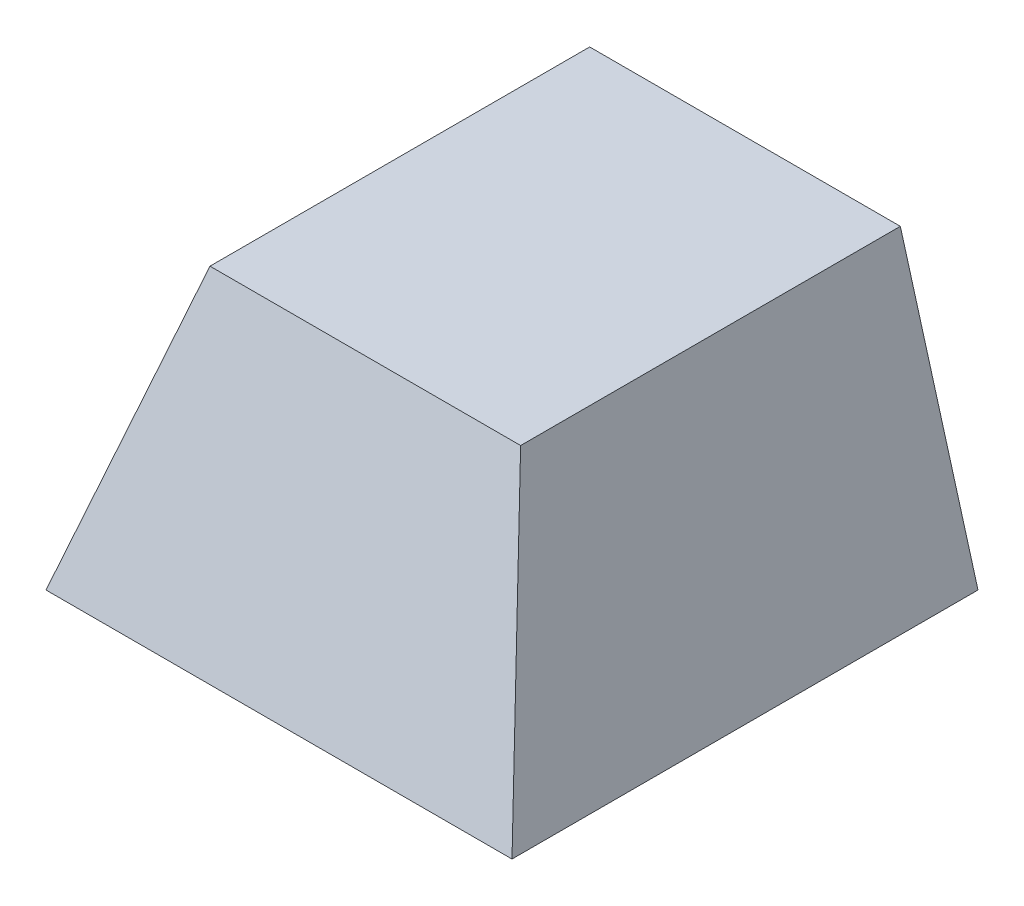
ISO-10303-21;
HEADER;
FILE_DESCRIPTION(('STEP AP214'),'2;1');
FILE_NAME('part.step','',(''),(''),'','','');
FILE_SCHEMA(('AUTOMOTIVE_DESIGN { 1 0 10303 214 1 1 1 1 }'));
ENDSEC;
DATA;
#1=APPLICATION_CONTEXT('core data for automotive mechanical design processes');
#2=APPLICATION_PROTOCOL_DEFINITION('international standard','automotive_design',2000,#1);
#3=PRODUCT_CONTEXT('',#1,'mechanical');
#4=PRODUCT('Part','Part','',(#3));
#5=PRODUCT_RELATED_PRODUCT_CATEGORY('part','',(#4));
#6=PRODUCT_DEFINITION_FORMATION('','',#4);
#7=PRODUCT_DEFINITION_CONTEXT('part definition',#1,'design');
#8=PRODUCT_DEFINITION('design','',#6,#7);
#9=PRODUCT_DEFINITION_SHAPE('','',#8);
#10=(LENGTH_UNIT() NAMED_UNIT(*) SI_UNIT(.MILLI.,.METRE.));
#11=(NAMED_UNIT(*) PLANE_ANGLE_UNIT() SI_UNIT($,.RADIAN.));
#12=(NAMED_UNIT(*) SI_UNIT($,.STERADIAN.) SOLID_ANGLE_UNIT());
#13=UNCERTAINTY_MEASURE_WITH_UNIT(LENGTH_MEASURE(1.E-05),#10,'distance_accuracy_value','');
#14=(GEOMETRIC_REPRESENTATION_CONTEXT(3) GLOBAL_UNCERTAINTY_ASSIGNED_CONTEXT((#13)) GLOBAL_UNIT_ASSIGNED_CONTEXT((#10,
#11,#12)) REPRESENTATION_CONTEXT('',''));
#15=CARTESIAN_POINT('',(0.,0.,0.));
#16=DIRECTION('',(0.,0.,1.));
#17=DIRECTION('',(1.,0.,0.));
#18=AXIS2_PLACEMENT_3D('',#15,#16,#17);
#19=CARTESIAN_POINT('',(-124.492349516088,-61.6423190247624,270.));
#20=DIRECTION('',(0.,1.,0.));
#21=DIRECTION('',(-1.,0.,0.));
#22=AXIS2_PLACEMENT_3D('',#19,#20,#21);
#23=PLANE('',#22);
#24=DIRECTION('',(1.,0.,0.));
#25=VECTOR('',#24,1.);
#26=CARTESIAN_POINT('',(-124.492349516088,-61.6423190247624,0.));
#27=LINE('',#26,#25);
#28=CARTESIAN_POINT('',(-124.492349516088,-61.6423190247624,0.));
#29=VERTEX_POINT('',#28);
#30=CARTESIAN_POINT('',(145.507650483912,-61.6423190247624,0.));
#31=VERTEX_POINT('',#30);
#32=EDGE_CURVE('E85',#29,#31,#27,.T.);
#33=ORIENTED_EDGE('',*,*,#32,.T.);
#34=DIRECTION('',(0.,0.,-1.));
#35=VECTOR('',#34,1.);
#36=CARTESIAN_POINT('',(145.507650483912,-61.6423190247624,270.));
#37=LINE('',#36,#35);
#38=CARTESIAN_POINT('',(145.507650483912,-61.6423190247624,270.));
#39=VERTEX_POINT('',#38);
#40=EDGE_CURVE('E11',#39,#31,#37,.T.);
#41=ORIENTED_EDGE('',*,*,#40,.F.);
#42=DIRECTION('',(1.,0.,0.));
#43=VECTOR('',#42,1.);
#44=CARTESIAN_POINT('',(-124.492349516088,-61.6423190247624,270.));
#45=LINE('',#44,#43);
#46=CARTESIAN_POINT('',(-124.492349516088,-61.6423190247624,270.));
#47=VERTEX_POINT('',#46);
#48=EDGE_CURVE('E86',#47,#39,#45,.T.);
#49=ORIENTED_EDGE('',*,*,#48,.F.);
#50=DIRECTION('',(0.,0.,-1.));
#51=VECTOR('',#50,1.);
#52=CARTESIAN_POINT('',(-124.492349516088,-61.6423190247624,270.));
#53=LINE('',#52,#51);
#54=EDGE_CURVE('E72',#47,#29,#53,.T.);
#55=ORIENTED_EDGE('',*,*,#54,.T.);
#56=EDGE_LOOP('',(#33,#41,#49,#55));
#57=FACE_BOUND('',#56,.T.);
#58=ADVANCED_FACE('F32',(#57),#23,.F.);
#59=CARTESIAN_POINT('',(145.507650483912,-61.6423190247624,270.));
#60=DIRECTION('',(-0.962650940153899,-0.270745576918285,0.));
#61=DIRECTION('',(0.270745576918285,-0.962650940153899,0.));
#62=AXIS2_PLACEMENT_3D('',#59,#60,#61);
#63=PLANE('',#62);
#64=DIRECTION('',(0.,0.,-1.));
#65=VECTOR('',#64,1.);
#66=CARTESIAN_POINT('',(100.507650483912,98.3576809752376,270.));
#67=LINE('',#66,#65);
#68=CARTESIAN_POINT('',(100.507650483912,98.3576809752376,220.));
#69=VERTEX_POINT('',#68);
#70=CARTESIAN_POINT('',(100.507650483912,98.3576809752376,0.));
#71=VERTEX_POINT('',#70);
#72=EDGE_CURVE('E40',#69,#71,#67,.T.);
#73=ORIENTED_EDGE('',*,*,#72,.F.);
#74=DIRECTION('',(0.259268040862055,-0.921841923065084,0.288075600957839));
#75=VECTOR('',#74,1.);
#76=CARTESIAN_POINT('',(145.507650483912,-61.6423190247624,270.));
#77=LINE('',#76,#75);
#78=EDGE_CURVE('E98',#69,#39,#77,.T.);
#79=ORIENTED_EDGE('',*,*,#78,.T.);
#80=ORIENTED_EDGE('',*,*,#40,.T.);
#81=DIRECTION('',(-0.270745576918285,0.962650940153899,0.));
#82=VECTOR('',#81,1.);
#83=CARTESIAN_POINT('',(145.507650483912,-61.6423190247624,0.));
#84=LINE('',#83,#82);
#85=EDGE_CURVE('E80',#31,#71,#84,.T.);
#86=ORIENTED_EDGE('',*,*,#85,.T.);
#87=EDGE_LOOP('',(#73,#79,#80,#86));
#88=FACE_BOUND('',#87,.T.);
#89=ADVANCED_FACE('F100',(#88),#63,.F.);
#90=CARTESIAN_POINT('',(-79.492349516088,98.3576809752376,270.));
#91=DIRECTION('',(0.,-1.,0.));
#92=DIRECTION('',(1.,0.,0.));
#93=AXIS2_PLACEMENT_3D('',#90,#91,#92);
#94=PLANE('',#93);
#95=DIRECTION('',(0.,0.,-1.));
#96=VECTOR('',#95,1.);
#97=CARTESIAN_POINT('',(-79.492349516088,98.3576809752376,270.));
#98=LINE('',#97,#96);
#99=CARTESIAN_POINT('',(-79.492349516088,98.3576809752376,220.));
#100=VERTEX_POINT('',#99);
#101=CARTESIAN_POINT('',(-79.492349516088,98.3576809752376,0.));
#102=VERTEX_POINT('',#101);
#103=EDGE_CURVE('E63',#100,#102,#98,.T.);
#104=ORIENTED_EDGE('',*,*,#103,.F.);
#105=DIRECTION('',(-1.,0.,0.));
#106=VECTOR('',#105,1.);
#107=CARTESIAN_POINT('',(200.507650483912,98.3576809752376,220.));
#108=LINE('',#107,#106);
#109=EDGE_CURVE('E101',#69,#100,#108,.T.);
#110=ORIENTED_EDGE('',*,*,#109,.F.);
#111=ORIENTED_EDGE('',*,*,#72,.T.);
#112=DIRECTION('',(-1.,0.,0.));
#113=VECTOR('',#112,1.);
#114=CARTESIAN_POINT('',(-79.492349516088,98.3576809752376,0.));
#115=LINE('',#114,#113);
#116=EDGE_CURVE('E75',#71,#102,#115,.T.);
#117=ORIENTED_EDGE('',*,*,#116,.T.);
#118=EDGE_LOOP('',(#104,#110,#111,#117));
#119=FACE_BOUND('',#118,.T.);
#120=ADVANCED_FACE('F76',(#119),#94,.F.);
#121=CARTESIAN_POINT('',(-124.492349516088,-61.6423190247624,270.));
#122=DIRECTION('',(0.962650940153899,-0.270745576918284,0.));
#123=DIRECTION('',(0.270745576918284,0.962650940153899,0.));
#124=AXIS2_PLACEMENT_3D('',#121,#122,#123);
#125=PLANE('',#124);
#126=ORIENTED_EDGE('',*,*,#54,.F.);
#127=DIRECTION('',(-0.259268040862055,-0.921841923065084,0.288075600957839));
#128=VECTOR('',#127,1.);
#129=CARTESIAN_POINT('',(-81.2252389850218,92.1962961968061,221.92543274326));
#130=LINE('',#129,#128);
#131=EDGE_CURVE('E47',#100,#47,#130,.T.);
#132=ORIENTED_EDGE('',*,*,#131,.F.);
#133=ORIENTED_EDGE('',*,*,#103,.T.);
#134=DIRECTION('',(-0.270745576918284,-0.962650940153899,0.));
#135=VECTOR('',#134,1.);
#136=CARTESIAN_POINT('',(-124.492349516088,-61.6423190247624,0.));
#137=LINE('',#136,#135);
#138=EDGE_CURVE('E67',#102,#29,#137,.T.);
#139=ORIENTED_EDGE('',*,*,#138,.T.);
#140=EDGE_LOOP('',(#126,#132,#133,#139));
#141=FACE_BOUND('',#140,.T.);
#142=ADVANCED_FACE('F65',(#141),#125,.F.);
#143=CARTESIAN_POINT('',(0.,0.,0.));
#144=DIRECTION('',(0.,0.,1.));
#145=DIRECTION('',(1.,0.,0.));
#146=AXIS2_PLACEMENT_3D('',#143,#144,#145);
#147=PLANE('',#146);
#148=ORIENTED_EDGE('',*,*,#32,.F.);
#149=ORIENTED_EDGE('',*,*,#138,.F.);
#150=ORIENTED_EDGE('',*,*,#116,.F.);
#151=ORIENTED_EDGE('',*,*,#85,.F.);
#152=EDGE_LOOP('',(#148,#149,#150,#151));
#153=FACE_BOUND('',#152,.T.);
#154=ADVANCED_FACE('F83',(#153),#147,.F.);
#155=CARTESIAN_POINT('',(198.774761014978,92.1962961968061,221.92543274326));
#156=DIRECTION('',(0.,-0.298274993135947,-0.95447997803503));
#157=DIRECTION('',(0.,0.95447997803503,-0.298274993135947));
#158=AXIS2_PLACEMENT_3D('',#155,#156,#157);
#159=PLANE('',#158);
#160=ORIENTED_EDGE('',*,*,#109,.T.);
#161=ORIENTED_EDGE('',*,*,#131,.T.);
#162=ORIENTED_EDGE('',*,*,#48,.T.);
#163=ORIENTED_EDGE('',*,*,#78,.F.);
#164=EDGE_LOOP('',(#160,#161,#162,#163));
#165=FACE_BOUND('',#164,.T.);
#166=ADVANCED_FACE('F96',(#165),#159,.F.);
#167=CLOSED_SHELL('',(#58,#89,#120,#142,#154,#166));
#168=MANIFOLD_SOLID_BREP('B2',#167);
#169=ADVANCED_BREP_SHAPE_REPRESENTATION('',(#18,#168),#14);
#170=SHAPE_DEFINITION_REPRESENTATION(#9,#169);
ENDSEC;
END-ISO-10303-21;
